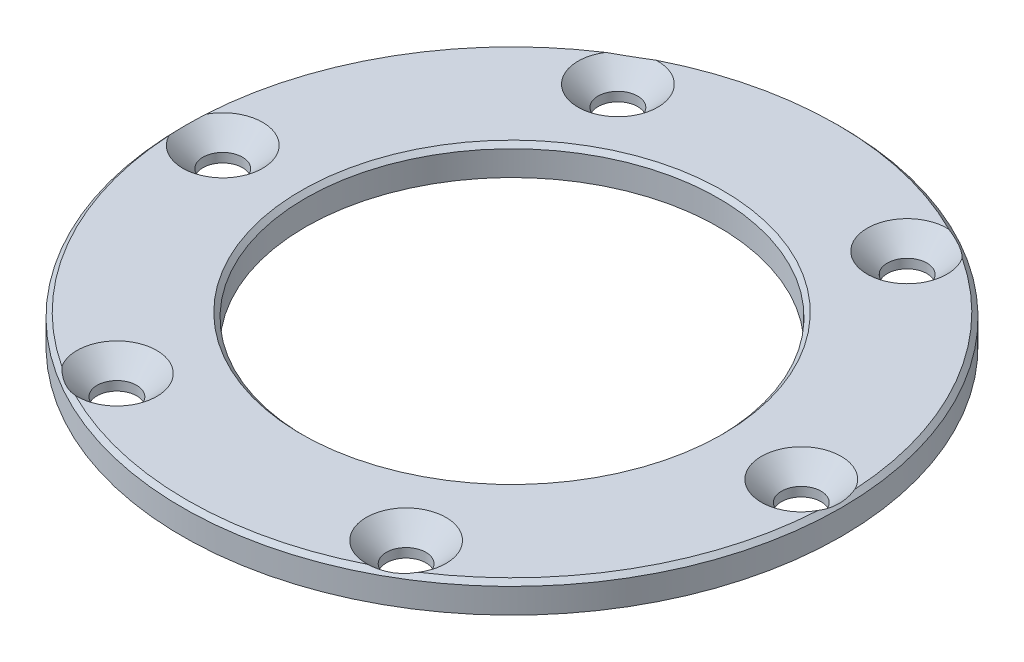
ISO-10303-21;
HEADER;
FILE_DESCRIPTION(('STEP AP214'),'2;1');
FILE_NAME('part.step','',(''),(''),'','','');
FILE_SCHEMA(('AUTOMOTIVE_DESIGN { 1 0 10303 214 1 1 1 1 }'));
ENDSEC;
DATA;
#1=APPLICATION_CONTEXT('core data for automotive mechanical design processes');
#2=APPLICATION_PROTOCOL_DEFINITION('international standard','automotive_design',2000,#1);
#3=PRODUCT_CONTEXT('',#1,'mechanical');
#4=PRODUCT('Part','Part','',(#3));
#5=PRODUCT_RELATED_PRODUCT_CATEGORY('part','',(#4));
#6=PRODUCT_DEFINITION_FORMATION('','',#4);
#7=PRODUCT_DEFINITION_CONTEXT('part definition',#1,'design');
#8=PRODUCT_DEFINITION('design','',#6,#7);
#9=PRODUCT_DEFINITION_SHAPE('','',#8);
#10=(LENGTH_UNIT() NAMED_UNIT(*) SI_UNIT(.MILLI.,.METRE.));
#11=(NAMED_UNIT(*) PLANE_ANGLE_UNIT() SI_UNIT($,.RADIAN.));
#12=(NAMED_UNIT(*) SI_UNIT($,.STERADIAN.) SOLID_ANGLE_UNIT());
#13=UNCERTAINTY_MEASURE_WITH_UNIT(LENGTH_MEASURE(1.E-05),#10,'distance_accuracy_value','');
#14=(GEOMETRIC_REPRESENTATION_CONTEXT(3) GLOBAL_UNCERTAINTY_ASSIGNED_CONTEXT((#13)) GLOBAL_UNIT_ASSIGNED_CONTEXT((#10,
#11,#12)) REPRESENTATION_CONTEXT('',''));
#15=CARTESIAN_POINT('',(0.,0.,0.));
#16=DIRECTION('',(0.,0.,1.));
#17=DIRECTION('',(1.,0.,0.));
#18=AXIS2_PLACEMENT_3D('',#15,#16,#17);
#19=CARTESIAN_POINT('',(0.,148.499999999998,0.));
#20=DIRECTION('',(0.,-1.,0.));
#21=DIRECTION('',(-1.,0.,0.));
#22=AXIS2_PLACEMENT_3D('',#19,#20,#21);
#23=CYLINDRICAL_SURFACE('',#22,22.5);
#24=CARTESIAN_POINT('',(0.,148.199999999998,0.));
#25=DIRECTION('',(0.,-1.,0.));
#26=DIRECTION('',(1.,0.,0.));
#27=AXIS2_PLACEMENT_3D('',#24,#25,#26);
#28=CIRCLE('',#27,22.5);
#29=CARTESIAN_POINT('',(22.5,148.199999999998,0.));
#30=VERTEX_POINT('',#29);
#31=EDGE_CURVE('E11',#30,#30,#28,.F.);
#32=ORIENTED_EDGE('',*,*,#31,.F.);
#33=EDGE_LOOP('',(#32));
#34=FACE_BOUND('',#33,.T.);
#35=CARTESIAN_POINT('',(0.,146.499999999998,0.));
#36=DIRECTION('',(0.,-1.,0.));
#37=DIRECTION('',(1.,0.,0.));
#38=AXIS2_PLACEMENT_3D('',#35,#36,#37);
#39=CIRCLE('',#38,22.5);
#40=CARTESIAN_POINT('',(22.5,146.499999999998,0.));
#41=VERTEX_POINT('',#40);
#42=EDGE_CURVE('E24',#41,#41,#39,.T.);
#43=ORIENTED_EDGE('',*,*,#42,.F.);
#44=EDGE_LOOP('',(#43));
#45=FACE_BOUND('',#44,.T.);
#46=ADVANCED_FACE('F17',(#34,#45),#23,.T.);
#47=CARTESIAN_POINT('',(0.,148.499999999998,0.));
#48=DIRECTION('',(0.,1.,0.));
#49=DIRECTION('',(1.,0.,0.));
#50=AXIS2_PLACEMENT_3D('',#47,#48,#49);
#51=PLANE('',#50);
#52=CARTESIAN_POINT('',(-9.875,148.499999999998,-17.1040017247426));
#53=DIRECTION('',(0.,-1.,0.));
#54=DIRECTION('',(1.,0.,0.));
#55=AXIS2_PLACEMENT_3D('',#52,#53,#54);
#56=CIRCLE('',#55,2.7239523644641);
#57=CARTESIAN_POINT('',(-9.98936859496402,148.499999999998,-19.8255520748842));
#58=VERTEX_POINT('',#57);
#59=CARTESIAN_POINT('',(-12.174747443419,148.499999999998,-18.5638230084474));
#60=VERTEX_POINT('',#59);
#61=EDGE_CURVE('E31',#58,#60,#56,.T.);
#62=ORIENTED_EDGE('',*,*,#61,.T.);
#63=CARTESIAN_POINT('',(0.,148.499999999998,0.));
#64=DIRECTION('',(0.,-1.,0.));
#65=DIRECTION('',(1.,0.,0.));
#66=AXIS2_PLACEMENT_3D('',#63,#64,#65);
#67=CIRCLE('',#66,22.2);
#68=CARTESIAN_POINT('',(-22.164116038383,148.499999999998,-1.26172906643674));
#69=VERTEX_POINT('',#68);
#70=EDGE_CURVE('E35',#69,#60,#67,.T.);
#71=ORIENTED_EDGE('',*,*,#70,.F.);
#72=CARTESIAN_POINT('',(-19.75,148.499999999998,0.));
#73=DIRECTION('',(0.,-1.,0.));
#74=DIRECTION('',(1.,0.,0.));
#75=AXIS2_PLACEMENT_3D('',#72,#73,#74);
#76=CIRCLE('',#75,2.7239523644641);
#77=CARTESIAN_POINT('',(-22.164116038383,148.499999999998,1.26172906643685));
#78=VERTEX_POINT('',#77);
#79=EDGE_CURVE('E89',#69,#78,#76,.T.);
#80=ORIENTED_EDGE('',*,*,#79,.T.);
#81=CARTESIAN_POINT('',(-12.174747443419,148.499999999998,18.5638230084475));
#82=VERTEX_POINT('',#81);
#83=EDGE_CURVE('E90',#82,#78,#67,.T.);
#84=ORIENTED_EDGE('',*,*,#83,.F.);
#85=CARTESIAN_POINT('',(-9.875,148.499999999998,17.1040017247427));
#86=DIRECTION('',(0.,-1.,0.));
#87=DIRECTION('',(1.,0.,0.));
#88=AXIS2_PLACEMENT_3D('',#85,#86,#87);
#89=CIRCLE('',#88,2.7239523644641);
#90=CARTESIAN_POINT('',(-9.98936859496404,148.499999999998,19.8255520748843));
#91=VERTEX_POINT('',#90);
#92=EDGE_CURVE('E93',#82,#91,#89,.T.);
#93=ORIENTED_EDGE('',*,*,#92,.T.);
#94=CARTESIAN_POINT('',(9.98936859496403,148.499999999998,19.8255520748843));
#95=VERTEX_POINT('',#94);
#96=EDGE_CURVE('E95',#95,#91,#67,.T.);
#97=ORIENTED_EDGE('',*,*,#96,.F.);
#98=CARTESIAN_POINT('',(9.875,148.499999999998,17.1040017247427));
#99=DIRECTION('',(0.,-1.,0.));
#100=DIRECTION('',(1.,0.,0.));
#101=AXIS2_PLACEMENT_3D('',#98,#99,#100);
#102=CIRCLE('',#101,2.7239523644641);
#103=CARTESIAN_POINT('',(12.174747443419,148.499999999998,18.5638230084475));
#104=VERTEX_POINT('',#103);
#105=EDGE_CURVE('E96',#95,#104,#102,.T.);
#106=ORIENTED_EDGE('',*,*,#105,.T.);
#107=CARTESIAN_POINT('',(22.1641160383888,148.499999999993,1.26172906641579));
#108=VERTEX_POINT('',#107);
#109=EDGE_CURVE('E98',#108,#104,#67,.T.);
#110=ORIENTED_EDGE('',*,*,#109,.F.);
#111=CARTESIAN_POINT('',(19.75,148.499999999998,0.));
#112=DIRECTION('',(0.,-1.,0.));
#113=DIRECTION('',(1.,0.,0.));
#114=AXIS2_PLACEMENT_3D('',#111,#112,#113);
#115=CIRCLE('',#114,2.7239523644641);
#116=CARTESIAN_POINT('',(22.164116038383,148.499999999998,-1.26172906643674));
#117=VERTEX_POINT('',#116);
#118=EDGE_CURVE('E99',#108,#117,#115,.T.);
#119=ORIENTED_EDGE('',*,*,#118,.T.);
#120=CARTESIAN_POINT('',(12.174747443419,148.499999999998,-18.5638230084474));
#121=VERTEX_POINT('',#120);
#122=EDGE_CURVE('E76',#121,#117,#67,.T.);
#123=ORIENTED_EDGE('',*,*,#122,.F.);
#124=CARTESIAN_POINT('',(9.875,148.499999999998,-17.1040017247426));
#125=DIRECTION('',(0.,-1.,0.));
#126=DIRECTION('',(1.,0.,0.));
#127=AXIS2_PLACEMENT_3D('',#124,#125,#126);
#128=CIRCLE('',#127,2.7239523644641);
#129=CARTESIAN_POINT('',(9.98936859496405,148.499999999998,-19.8255520748842));
#130=VERTEX_POINT('',#129);
#131=EDGE_CURVE('E70',#121,#130,#128,.T.);
#132=ORIENTED_EDGE('',*,*,#131,.T.);
#133=EDGE_CURVE('E65',#58,#130,#67,.T.);
#134=ORIENTED_EDGE('',*,*,#133,.F.);
#135=EDGE_LOOP('',(#62,#71,#80,#84,#93,#97,#106,#110,#119,#123,#132,#134));
#136=FACE_BOUND('',#135,.T.);
#137=CARTESIAN_POINT('',(0.,148.499999999998,0.));
#138=DIRECTION('',(0.,-1.,0.));
#139=DIRECTION('',(1.,0.,0.));
#140=AXIS2_PLACEMENT_3D('',#137,#138,#139);
#141=CIRCLE('',#140,14.4);
#142=CARTESIAN_POINT('',(14.4,148.499999999998,0.));
#143=VERTEX_POINT('',#142);
#144=EDGE_CURVE('E74',#143,#143,#141,.F.);
#145=ORIENTED_EDGE('',*,*,#144,.F.);
#146=EDGE_LOOP('',(#145));
#147=FACE_BOUND('',#146,.T.);
#148=ADVANCED_FACE('F67',(#136,#147),#51,.T.);
#149=CARTESIAN_POINT('',(0.,146.499999999998,0.));
#150=DIRECTION('',(0.,1.,0.));
#151=DIRECTION('',(1.,0.,0.));
#152=AXIS2_PLACEMENT_3D('',#149,#150,#151);
#153=PLANE('',#152);
#154=CARTESIAN_POINT('',(-9.875,146.499999999998,-17.1040017247426));
#155=DIRECTION('',(0.,-1.,0.));
#156=DIRECTION('',(1.,0.,0.));
#157=AXIS2_PLACEMENT_3D('',#154,#155,#156);
#158=CIRCLE('',#157,1.35);
#159=CARTESIAN_POINT('',(-8.525,146.499999999998,-17.1040017247426));
#160=VERTEX_POINT('',#159);
#161=EDGE_CURVE('E104',#160,#160,#158,.T.);
#162=ORIENTED_EDGE('',*,*,#161,.F.);
#163=EDGE_LOOP('',(#162));
#164=FACE_BOUND('',#163,.T.);
#165=CARTESIAN_POINT('',(9.875,146.499999999998,-17.1040017247426));
#166=DIRECTION('',(0.,-1.,0.));
#167=DIRECTION('',(1.,0.,0.));
#168=AXIS2_PLACEMENT_3D('',#165,#166,#167);
#169=CIRCLE('',#168,1.35);
#170=CARTESIAN_POINT('',(11.225,146.499999999998,-17.1040017247426));
#171=VERTEX_POINT('',#170);
#172=EDGE_CURVE('E107',#171,#171,#169,.T.);
#173=ORIENTED_EDGE('',*,*,#172,.F.);
#174=EDGE_LOOP('',(#173));
#175=FACE_BOUND('',#174,.T.);
#176=CARTESIAN_POINT('',(19.75,146.499999999998,0.));
#177=DIRECTION('',(0.,-1.,0.));
#178=DIRECTION('',(1.,0.,0.));
#179=AXIS2_PLACEMENT_3D('',#176,#177,#178);
#180=CIRCLE('',#179,1.35);
#181=CARTESIAN_POINT('',(21.1,146.499999999998,0.));
#182=VERTEX_POINT('',#181);
#183=EDGE_CURVE('E110',#182,#182,#180,.T.);
#184=ORIENTED_EDGE('',*,*,#183,.F.);
#185=EDGE_LOOP('',(#184));
#186=FACE_BOUND('',#185,.T.);
#187=CARTESIAN_POINT('',(9.875,146.499999999998,17.1040017247427));
#188=DIRECTION('',(0.,-1.,0.));
#189=DIRECTION('',(1.,0.,0.));
#190=AXIS2_PLACEMENT_3D('',#187,#188,#189);
#191=CIRCLE('',#190,1.35);
#192=CARTESIAN_POINT('',(11.225,146.499999999998,17.1040017247427));
#193=VERTEX_POINT('',#192);
#194=EDGE_CURVE('E113',#193,#193,#191,.T.);
#195=ORIENTED_EDGE('',*,*,#194,.F.);
#196=EDGE_LOOP('',(#195));
#197=FACE_BOUND('',#196,.T.);
#198=CARTESIAN_POINT('',(-9.875,146.499999999998,17.1040017247427));
#199=DIRECTION('',(0.,-1.,0.));
#200=DIRECTION('',(1.,0.,0.));
#201=AXIS2_PLACEMENT_3D('',#198,#199,#200);
#202=CIRCLE('',#201,1.35);
#203=CARTESIAN_POINT('',(-8.525,146.499999999998,17.1040017247427));
#204=VERTEX_POINT('',#203);
#205=EDGE_CURVE('E116',#204,#204,#202,.T.);
#206=ORIENTED_EDGE('',*,*,#205,.F.);
#207=EDGE_LOOP('',(#206));
#208=FACE_BOUND('',#207,.T.);
#209=CARTESIAN_POINT('',(-19.75,146.499999999998,0.));
#210=DIRECTION('',(0.,-1.,0.));
#211=DIRECTION('',(1.,0.,0.));
#212=AXIS2_PLACEMENT_3D('',#209,#210,#211);
#213=CIRCLE('',#212,1.35);
#214=CARTESIAN_POINT('',(-18.4,146.499999999998,0.));
#215=VERTEX_POINT('',#214);
#216=EDGE_CURVE('E119',#215,#215,#213,.T.);
#217=ORIENTED_EDGE('',*,*,#216,.F.);
#218=EDGE_LOOP('',(#217));
#219=FACE_BOUND('',#218,.T.);
#220=CARTESIAN_POINT('',(0.,146.499999999998,0.));
#221=DIRECTION('',(0.,-1.,0.));
#222=DIRECTION('',(1.,0.,0.));
#223=AXIS2_PLACEMENT_3D('',#220,#221,#222);
#224=CIRCLE('',#223,14.1);
#225=CARTESIAN_POINT('',(14.1,146.499999999998,0.));
#226=VERTEX_POINT('',#225);
#227=EDGE_CURVE('E122',#226,#226,#224,.F.);
#228=ORIENTED_EDGE('',*,*,#227,.T.);
#229=EDGE_LOOP('',(#228));
#230=FACE_BOUND('',#229,.T.);
#231=ORIENTED_EDGE('',*,*,#42,.T.);
#232=EDGE_LOOP('',(#231));
#233=FACE_BOUND('',#232,.T.);
#234=ADVANCED_FACE('F209',(#164,#175,#186,#197,#208,#219,#230,#233),#153,.F.);
#235=CARTESIAN_POINT('',(0.,138.499999999998,0.));
#236=DIRECTION('',(0.,1.,0.));
#237=DIRECTION('',(-1.,0.,0.));
#238=AXIS2_PLACEMENT_3D('',#235,#236,#237);
#239=CYLINDRICAL_SURFACE('',#238,14.1);
#240=CARTESIAN_POINT('',(0.,148.199999999998,0.));
#241=DIRECTION('',(0.,-1.,0.));
#242=DIRECTION('',(1.,0.,0.));
#243=AXIS2_PLACEMENT_3D('',#240,#241,#242);
#244=CIRCLE('',#243,14.1);
#245=CARTESIAN_POINT('',(14.1,148.199999999998,0.));
#246=VERTEX_POINT('',#245);
#247=EDGE_CURVE('E82',#246,#246,#244,.T.);
#248=ORIENTED_EDGE('',*,*,#247,.F.);
#249=EDGE_LOOP('',(#248));
#250=FACE_BOUND('',#249,.T.);
#251=ORIENTED_EDGE('',*,*,#227,.F.);
#252=EDGE_LOOP('',(#251));
#253=FACE_BOUND('',#252,.T.);
#254=ADVANCED_FACE('F215',(#250,#253),#239,.F.);
#255=CARTESIAN_POINT('',(0.,148.499999999998,0.));
#256=DIRECTION('',(0.,1.,0.));
#257=DIRECTION('',(1.,0.,0.));
#258=AXIS2_PLACEMENT_3D('',#255,#256,#257);
#259=CONICAL_SURFACE('',#258,14.4,0.785398163397448);
#260=ORIENTED_EDGE('',*,*,#247,.T.);
#261=EDGE_LOOP('',(#260));
#262=FACE_BOUND('',#261,.T.);
#263=ORIENTED_EDGE('',*,*,#144,.T.);
#264=EDGE_LOOP('',(#263));
#265=FACE_BOUND('',#264,.T.);
#266=ADVANCED_FACE('F144',(#262,#265),#259,.F.);
#267=CARTESIAN_POINT('',(0.,148.499999999998,0.));
#268=DIRECTION('',(0.,-1.,0.));
#269=DIRECTION('',(-1.,0.,0.));
#270=AXIS2_PLACEMENT_3D('',#267,#268,#269);
#271=CONICAL_SURFACE('',#270,22.2,0.785398163397451);
#272=CARTESIAN_POINT('',(-12.1754131020972,148.500199999998,-18.5631472502181));
#273=CARTESIAN_POINT('',(-12.0991354940543,148.477245006528,-18.6406361657122));
#274=CARTESIAN_POINT('',(-12.0198524515073,148.456932782419,-18.716009225925));
#275=CARTESIAN_POINT('',(-11.8555912026091,148.42196769394,-18.8617966313019));
#276=CARTESIAN_POINT('',(-11.7706093406277,148.407318503794,-18.9322077329658));
#277=CARTESIAN_POINT('',(-11.5979661430153,148.38442878904,-19.0652382232727));
#278=CARTESIAN_POINT('',(-11.5104591600865,148.376010984705,-19.1280268283725));
#279=CARTESIAN_POINT('',(-11.3310683527894,148.365095106497,-19.2475047776166));
#280=CARTESIAN_POINT('',(-11.2391862876018,148.36259467347,-19.3041965438597));
#281=CARTESIAN_POINT('',(-11.0554419751498,148.363554032639,-19.4088833938827));
#282=CARTESIAN_POINT('',(-10.9637242357483,148.366780764826,-19.4571346610699));
#283=CARTESIAN_POINT('',(-10.777536264253,148.378669208162,-19.5473064961766));
#284=CARTESIAN_POINT('',(-10.6830651699169,148.387332639694,-19.5892250549685));
#285=CARTESIAN_POINT('',(-10.4893231929499,148.410230927378,-19.6677146513345));
#286=CARTESIAN_POINT('',(-10.3899928320523,148.424621950263,-19.7040924625305));
#287=CARTESIAN_POINT('',(-10.1900265034941,148.458601256755,-19.7700284286542));
#288=CARTESIAN_POINT('',(-10.0893913188105,148.478186549339,-19.7995904900501));
#289=CARTESIAN_POINT('',(-9.98845054183149,148.500199999998,-19.8257906730951));
#290=B_SPLINE_CURVE_WITH_KNOTS('',3,(#272,#273,#274,#275,#276,#277,#278,#279,#280,#281,#282,
#283,#284,#285,#286,#287,#288,#289),.UNSPECIFIED.,.F.,.F.,(4,2,2,2,2,2,2,2,4),(0.,
0.333360644824797,0.666937215272782,0.990614736175415,1.31416319056383,1.62484543312623,
1.93562603728323,2.25553469998118,2.57525954767152),.UNSPECIFIED.);
#291=EDGE_CURVE('E78',#60,#58,#290,.T.);
#292=ORIENTED_EDGE('',*,*,#291,.T.);
#293=ORIENTED_EDGE('',*,*,#133,.T.);
#294=CARTESIAN_POINT('',(9.98845054183152,148.500199999998,-19.8257906730951));
#295=CARTESIAN_POINT('',(10.0936967151826,148.477245006528,-19.7984767845371));
#296=CARTESIAN_POINT('',(10.1986132213614,148.456932782419,-19.7675021857085));
#297=CARTESIAN_POINT('',(10.4069994424188,148.42196769394,-19.6981414739938));
#298=CARTESIAN_POINT('',(10.5104681761589,148.407318503794,-19.6597505734889));
#299=CARTESIAN_POINT('',(10.7119975590487,148.38442878904,-19.5767524237195));
#300=CARTESIAN_POINT('',(10.8101275775977,148.376010984705,-19.5323634560445));
#301=CARTESIAN_POINT('',(11.0032939204837,148.365095106497,-19.4367454343418));
#302=CARTESIAN_POINT('',(11.0983314628294,148.36259467347,-19.3855191148587));
#303=CARTESIAN_POINT('',(11.2808650906175,148.363554032639,-19.2787352974858));
#304=CARTESIAN_POINT('',(11.3685107834672,148.366780764826,-19.2234310387801));
#305=CARTESIAN_POINT('',(11.5396958691231,148.378669208162,-19.1072734431395));
#306=CARTESIAN_POINT('',(11.623233953095,148.387332639694,-19.046418354917));
#307=CARTESIAN_POINT('',(11.7880789259643,148.410230927378,-18.9178776792672));
#308=CARTESIAN_POINT('',(11.8692482150429,148.424621950263,-18.8500439689608));
#309=CARTESIAN_POINT('',(12.0263336010082,148.458601256755,-18.7098360315897));
#310=CARTESIAN_POINT('',(12.102252689507,148.478186549339,-18.6374644358371));
#311=CARTESIAN_POINT('',(12.1754131020972,148.500199999998,-18.563147250218));
#312=B_SPLINE_CURVE_WITH_KNOTS('',3,(#294,#295,#296,#297,#298,#299,#300,#301,#302,#303,#304,
#305,#306,#307,#308,#309,#310,#311),.UNSPECIFIED.,.F.,.F.,(4,2,2,2,2,2,2,2,4),(0.,
0.333360644824834,0.666937215272804,0.990614736175439,1.31416319056387,1.62484543312629,
1.93562603728329,2.25553469998123,2.57525954767161),.UNSPECIFIED.);
#313=EDGE_CURVE('E83',#130,#121,#312,.T.);
#314=ORIENTED_EDGE('',*,*,#313,.T.);
#315=ORIENTED_EDGE('',*,*,#122,.T.);
#316=CARTESIAN_POINT('',(22.1638636439287,148.500199999998,-1.26264342287697));
#317=CARTESIAN_POINT('',(22.1928322092369,148.477245006528,-1.15784061882487));
#318=CARTESIAN_POINT('',(22.2184656728687,148.456932782419,-1.05149295978341));
#319=CARTESIAN_POINT('',(22.2625906450279,148.42196769394,-0.836344842691737));
#320=CARTESIAN_POINT('',(22.2810775167866,148.407318503794,-0.727542840522983));
#321=CARTESIAN_POINT('',(22.309963702064,148.38442878904,-0.51151420044662));
#322=CARTESIAN_POINT('',(22.3205867376842,148.376010984705,-0.404336627671881));
#323=CARTESIAN_POINT('',(22.3343622732731,148.365095106497,-0.189240656725157));
#324=CARTESIAN_POINT('',(22.3375177504312,148.36259467347,-0.0813225709989644));
#325=CARTESIAN_POINT('',(22.3363070657673,148.363554032639,0.130148096396913));
#326=CARTESIAN_POINT('',(22.3322350192155,148.366780764826,0.233703622289854));
#327=CARTESIAN_POINT('',(22.3172321333762,148.378669208162,0.440033053037222));
#328=CARTESIAN_POINT('',(22.3062991230119,148.387332639694,0.542806700051582));
#329=CARTESIAN_POINT('',(22.2774021189141,148.410230927378,0.749836972067454));
#330=CARTESIAN_POINT('',(22.2592410470952,148.424621950263,0.854048493569845));
#331=CARTESIAN_POINT('',(22.2163601045023,148.458601256755,1.06019239706461));
#332=CARTESIAN_POINT('',(22.1916440083175,148.478186549339,1.16212605421309));
#333=CARTESIAN_POINT('',(22.1638636439287,148.500199999998,1.2626434228771));
#334=B_SPLINE_CURVE_WITH_KNOTS('',3,(#316,#317,#318,#319,#320,#321,#322,#323,#324,#325,#326,
#327,#328,#329,#330,#331,#332,#333),.UNSPECIFIED.,.F.,.F.,(4,2,2,2,2,2,2,2,4),(0.,
0.333360644824826,0.666937215272805,0.990614736175445,1.31416319056387,1.62484543312629,
1.93562603728329,2.25553469998122,2.57525954767159),.UNSPECIFIED.);
#335=EDGE_CURVE('E173',#117,#108,#334,.T.);
#336=ORIENTED_EDGE('',*,*,#335,.T.);
#337=ORIENTED_EDGE('',*,*,#109,.T.);
#338=CARTESIAN_POINT('',(12.1754131020972,148.500199999998,18.5631472502182));
#339=CARTESIAN_POINT('',(12.0991354940543,148.477245006528,18.6406361657123));
#340=CARTESIAN_POINT('',(12.0198524515073,148.456932782419,18.7160092259252));
#341=CARTESIAN_POINT('',(11.8555912026091,148.42196769394,18.8617966313021));
#342=CARTESIAN_POINT('',(11.7706093406277,148.407318503794,18.932207732966));
#343=CARTESIAN_POINT('',(11.5979661430153,148.38442878904,19.0652382232729));
#344=CARTESIAN_POINT('',(11.5104591600865,148.376010984705,19.1280268283727));
#345=CARTESIAN_POINT('',(11.3310683527894,148.365095106497,19.2475047776167));
#346=CARTESIAN_POINT('',(11.2391862876018,148.36259467347,19.3041965438598));
#347=CARTESIAN_POINT('',(11.0554419751498,148.363554032639,19.4088833938828));
#348=CARTESIAN_POINT('',(10.9637242357483,148.366780764826,19.45713466107));
#349=CARTESIAN_POINT('',(10.7775362642531,148.378669208162,19.5473064961768));
#350=CARTESIAN_POINT('',(10.6830651699169,148.387332639694,19.5892250549687));
#351=CARTESIAN_POINT('',(10.4893231929499,148.410230927378,19.6677146513347));
#352=CARTESIAN_POINT('',(10.3899928320523,148.424621950263,19.7040924625307));
#353=CARTESIAN_POINT('',(10.1900265034941,148.458601256755,19.7700284286544));
#354=CARTESIAN_POINT('',(10.0893913188105,148.478186549339,19.7995904900503));
#355=CARTESIAN_POINT('',(9.9884505418315,148.500199999998,19.8257906730952));
#356=B_SPLINE_CURVE_WITH_KNOTS('',3,(#338,#339,#340,#341,#342,#343,#344,#345,#346,#347,#348,
#349,#350,#351,#352,#353,#354,#355),.UNSPECIFIED.,.F.,.F.,(4,2,2,2,2,2,2,2,4),(0.,
0.333360644824836,0.666937215272802,0.990614736175438,1.31416319056387,1.62484543312629,
1.93562603728329,2.25553469998122,2.57525954767159),.UNSPECIFIED.);
#357=EDGE_CURVE('E167',#104,#95,#356,.T.);
#358=ORIENTED_EDGE('',*,*,#357,.T.);
#359=ORIENTED_EDGE('',*,*,#96,.T.);
#360=CARTESIAN_POINT('',(-9.98845054183151,148.500199999998,19.8257906730952));
#361=CARTESIAN_POINT('',(-10.0936967151826,148.477245006528,19.7984767845372));
#362=CARTESIAN_POINT('',(-10.1986132213614,148.456932782419,19.7675021857086));
#363=CARTESIAN_POINT('',(-10.4069994424188,148.42196769394,19.6981414739939));
#364=CARTESIAN_POINT('',(-10.5104681761588,148.407318503794,19.659750573489));
#365=CARTESIAN_POINT('',(-10.7119975590487,148.38442878904,19.5767524237196));
#366=CARTESIAN_POINT('',(-10.8101275775977,148.376010984705,19.5323634560446));
#367=CARTESIAN_POINT('',(-11.0032939204837,148.365095106497,19.4367454343419));
#368=CARTESIAN_POINT('',(-11.0983314628294,148.36259467347,19.3855191148588));
#369=CARTESIAN_POINT('',(-11.2808650906175,148.363554032639,19.2787352974859));
#370=CARTESIAN_POINT('',(-11.3685107834672,148.366780764826,19.2234310387802));
#371=CARTESIAN_POINT('',(-11.5396958691231,148.378669208162,19.1072734431396));
#372=CARTESIAN_POINT('',(-11.623233953095,148.387332639694,19.0464183549171));
#373=CARTESIAN_POINT('',(-11.7880789259642,148.410230927378,18.9178776792673));
#374=CARTESIAN_POINT('',(-11.8692482150429,148.424621950263,18.8500439689609));
#375=CARTESIAN_POINT('',(-12.0263336010081,148.458601256755,18.7098360315898));
#376=CARTESIAN_POINT('',(-12.102252689507,148.478186549339,18.6374644358373));
#377=CARTESIAN_POINT('',(-12.1754131020972,148.500199999998,18.5631472502182));
#378=B_SPLINE_CURVE_WITH_KNOTS('',3,(#360,#361,#362,#363,#364,#365,#366,#367,#368,#369,#370,
#371,#372,#373,#374,#375,#376,#377),.UNSPECIFIED.,.F.,.F.,(4,2,2,2,2,2,2,2,4),(0.,
0.333360644824836,0.666937215272811,0.990614736175454,1.31416319056389,1.62484543312631,
1.9356260372833,2.25553469998123,2.5752595476716),.UNSPECIFIED.);
#379=EDGE_CURVE('E160',#91,#82,#378,.T.);
#380=ORIENTED_EDGE('',*,*,#379,.T.);
#381=ORIENTED_EDGE('',*,*,#83,.T.);
#382=CARTESIAN_POINT('',(-22.1638636439287,148.500199999998,1.26264342287709));
#383=CARTESIAN_POINT('',(-22.1928322092369,148.477245006528,1.15784061882499));
#384=CARTESIAN_POINT('',(-22.2184656728687,148.456932782419,1.05149295978353));
#385=CARTESIAN_POINT('',(-22.2625906450279,148.42196769394,0.836344842691855));
#386=CARTESIAN_POINT('',(-22.2810775167866,148.407318503794,0.727542840523101));
#387=CARTESIAN_POINT('',(-22.309963702064,148.38442878904,0.511514200446738));
#388=CARTESIAN_POINT('',(-22.3205867376842,148.376010984705,0.404336627671999));
#389=CARTESIAN_POINT('',(-22.3343622732731,148.365095106497,0.189240656725275));
#390=CARTESIAN_POINT('',(-22.3375177504312,148.36259467347,0.0813225709990819));
#391=CARTESIAN_POINT('',(-22.3363070657673,148.363554032639,-0.130148096396795));
#392=CARTESIAN_POINT('',(-22.3322350192155,148.366780764826,-0.233703622289735));
#393=CARTESIAN_POINT('',(-22.3172321333762,148.378669208162,-0.440033053037103));
#394=CARTESIAN_POINT('',(-22.3062991230119,148.387332639694,-0.542806700051464));
#395=CARTESIAN_POINT('',(-22.2774021189141,148.410230927378,-0.749836972067336));
#396=CARTESIAN_POINT('',(-22.2592410470952,148.424621950263,-0.854048493569726));
#397=CARTESIAN_POINT('',(-22.2163601045023,148.458601256755,-1.06019239706449));
#398=CARTESIAN_POINT('',(-22.1916440083175,148.478186549339,-1.16212605421297));
#399=CARTESIAN_POINT('',(-22.1638636439287,148.500199999998,-1.26264342287698));
#400=B_SPLINE_CURVE_WITH_KNOTS('',3,(#382,#383,#384,#385,#386,#387,#388,#389,#390,#391,#392,
#393,#394,#395,#396,#397,#398,#399),.UNSPECIFIED.,.F.,.F.,(4,2,2,2,2,2,2,2,4),(0.,
0.333360644824826,0.666937215272806,0.990614736175445,1.31416319056387,1.62484543312629,
1.93562603728329,2.25553469998122,2.57525954767158),.UNSPECIFIED.);
#401=EDGE_CURVE('E151',#78,#69,#400,.T.);
#402=ORIENTED_EDGE('',*,*,#401,.T.);
#403=ORIENTED_EDGE('',*,*,#70,.T.);
#404=EDGE_LOOP('',(#292,#293,#314,#315,#336,#337,#358,#359,#380,#381,#402,#403));
#405=FACE_BOUND('',#404,.T.);
#406=ORIENTED_EDGE('',*,*,#31,.T.);
#407=EDGE_LOOP('',(#406));
#408=FACE_BOUND('',#407,.T.);
#409=ADVANCED_FACE('F79',(#405,#408),#271,.T.);
#410=CARTESIAN_POINT('',(-19.75,148.526047635534,0.));
#411=DIRECTION('',(0.,1.,0.));
#412=DIRECTION('',(0.,0.,1.));
#413=AXIS2_PLACEMENT_3D('',#410,#411,#412);
#414=CYLINDRICAL_SURFACE('',#413,1.35);
#415=CARTESIAN_POINT('',(-19.75,147.126047635534,0.));
#416=DIRECTION('',(0.,-1.,0.));
#417=DIRECTION('',(0.,0.,1.));
#418=AXIS2_PLACEMENT_3D('',#415,#416,#417);
#419=CIRCLE('',#418,1.35);
#420=CARTESIAN_POINT('',(-19.75,147.126047635534,1.35000000000006));
#421=VERTEX_POINT('',#420);
#422=EDGE_CURVE('E267',#421,#421,#419,.T.);
#423=ORIENTED_EDGE('',*,*,#422,.F.);
#424=EDGE_LOOP('',(#423));
#425=FACE_BOUND('',#424,.T.);
#426=ORIENTED_EDGE('',*,*,#216,.T.);
#427=EDGE_LOOP('',(#426));
#428=FACE_BOUND('',#427,.T.);
#429=ADVANCED_FACE('F143',(#425,#428),#414,.F.);
#430=CARTESIAN_POINT('',(-19.75,148.526047635534,0.));
#431=DIRECTION('',(0.,1.,0.));
#432=DIRECTION('',(0.,0.,1.));
#433=AXIS2_PLACEMENT_3D('',#430,#431,#432);
#434=CONICAL_SURFACE('',#433,2.75,0.785398163397448);
#435=ORIENTED_EDGE('',*,*,#79,.F.);
#436=ORIENTED_EDGE('',*,*,#401,.F.);
#437=EDGE_LOOP('',(#435,#436));
#438=FACE_BOUND('',#437,.T.);
#439=ORIENTED_EDGE('',*,*,#422,.T.);
#440=EDGE_LOOP('',(#439));
#441=FACE_BOUND('',#440,.T.);
#442=ADVANCED_FACE('F238',(#438,#441),#434,.F.);
#443=CARTESIAN_POINT('',(-9.875,148.526047635534,17.1040017247427));
#444=DIRECTION('',(0.,1.,0.));
#445=DIRECTION('',(0.866025403784439,0.,0.5));
#446=AXIS2_PLACEMENT_3D('',#443,#444,#445);
#447=CYLINDRICAL_SURFACE('',#446,1.35);
#448=CARTESIAN_POINT('',(-9.875,147.126047635534,17.1040017247427));
#449=DIRECTION('',(0.,-1.,0.));
#450=DIRECTION('',(0.866025403784439,0.,0.5));
#451=AXIS2_PLACEMENT_3D('',#448,#449,#450);
#452=CIRCLE('',#451,1.35);
#453=CARTESIAN_POINT('',(-8.70586570489101,147.126047635534,17.7790017247427));
#454=VERTEX_POINT('',#453);
#455=EDGE_CURVE('E266',#454,#454,#452,.T.);
#456=ORIENTED_EDGE('',*,*,#455,.F.);
#457=EDGE_LOOP('',(#456));
#458=FACE_BOUND('',#457,.T.);
#459=ORIENTED_EDGE('',*,*,#205,.T.);
#460=EDGE_LOOP('',(#459));
#461=FACE_BOUND('',#460,.T.);
#462=ADVANCED_FACE('F244',(#458,#461),#447,.F.);
#463=CARTESIAN_POINT('',(-9.875,148.526047635534,17.1040017247427));
#464=DIRECTION('',(0.,1.,0.));
#465=DIRECTION('',(0.866025403784439,0.,0.5));
#466=AXIS2_PLACEMENT_3D('',#463,#464,#465);
#467=CONICAL_SURFACE('',#466,2.75,0.785398163397448);
#468=ORIENTED_EDGE('',*,*,#92,.F.);
#469=ORIENTED_EDGE('',*,*,#379,.F.);
#470=EDGE_LOOP('',(#468,#469));
#471=FACE_BOUND('',#470,.T.);
#472=ORIENTED_EDGE('',*,*,#455,.T.);
#473=EDGE_LOOP('',(#472));
#474=FACE_BOUND('',#473,.T.);
#475=ADVANCED_FACE('F250',(#471,#474),#467,.F.);
#476=CARTESIAN_POINT('',(9.875,148.526047635534,17.1040017247427));
#477=DIRECTION('',(0.,1.,0.));
#478=DIRECTION('',(0.866025403784439,0.,-0.5));
#479=AXIS2_PLACEMENT_3D('',#476,#477,#478);
#480=CYLINDRICAL_SURFACE('',#479,1.35);
#481=CARTESIAN_POINT('',(9.875,147.126047635534,17.1040017247427));
#482=DIRECTION('',(0.,-1.,0.));
#483=DIRECTION('',(0.866025403784439,0.,-0.5));
#484=AXIS2_PLACEMENT_3D('',#481,#482,#483);
#485=CIRCLE('',#484,1.35);
#486=CARTESIAN_POINT('',(11.044134295109,147.126047635534,16.4290017247428));
#487=VERTEX_POINT('',#486);
#488=EDGE_CURVE('E268',#487,#487,#485,.T.);
#489=ORIENTED_EDGE('',*,*,#488,.F.);
#490=EDGE_LOOP('',(#489));
#491=FACE_BOUND('',#490,.T.);
#492=ORIENTED_EDGE('',*,*,#194,.T.);
#493=EDGE_LOOP('',(#492));
#494=FACE_BOUND('',#493,.T.);
#495=ADVANCED_FACE('F253',(#491,#494),#480,.F.);
#496=CARTESIAN_POINT('',(9.875,148.526047635534,17.1040017247427));
#497=DIRECTION('',(0.,1.,0.));
#498=DIRECTION('',(0.866025403784439,0.,-0.5));
#499=AXIS2_PLACEMENT_3D('',#496,#497,#498);
#500=CONICAL_SURFACE('',#499,2.75,0.785398163397448);
#501=ORIENTED_EDGE('',*,*,#105,.F.);
#502=ORIENTED_EDGE('',*,*,#357,.F.);
#503=EDGE_LOOP('',(#501,#502));
#504=FACE_BOUND('',#503,.T.);
#505=ORIENTED_EDGE('',*,*,#488,.T.);
#506=EDGE_LOOP('',(#505));
#507=FACE_BOUND('',#506,.T.);
#508=ADVANCED_FACE('F186',(#504,#507),#500,.F.);
#509=CARTESIAN_POINT('',(19.75,148.526047635534,0.));
#510=DIRECTION('',(0.,1.,0.));
#511=DIRECTION('',(0.,0.,-1.));
#512=AXIS2_PLACEMENT_3D('',#509,#510,#511);
#513=CYLINDRICAL_SURFACE('',#512,1.35);
#514=CARTESIAN_POINT('',(19.75,147.126047635534,0.));
#515=DIRECTION('',(0.,-1.,0.));
#516=DIRECTION('',(0.,0.,-1.));
#517=AXIS2_PLACEMENT_3D('',#514,#515,#516);
#518=CIRCLE('',#517,1.35);
#519=CARTESIAN_POINT('',(19.75,147.126047635534,-1.34999999999994));
#520=VERTEX_POINT('',#519);
#521=EDGE_CURVE('E272',#520,#520,#518,.T.);
#522=ORIENTED_EDGE('',*,*,#521,.F.);
#523=EDGE_LOOP('',(#522));
#524=FACE_BOUND('',#523,.T.);
#525=ORIENTED_EDGE('',*,*,#183,.T.);
#526=EDGE_LOOP('',(#525));
#527=FACE_BOUND('',#526,.T.);
#528=ADVANCED_FACE('F184',(#524,#527),#513,.F.);
#529=CARTESIAN_POINT('',(19.75,148.526047635534,0.));
#530=DIRECTION('',(0.,1.,0.));
#531=DIRECTION('',(0.,0.,-1.));
#532=AXIS2_PLACEMENT_3D('',#529,#530,#531);
#533=CONICAL_SURFACE('',#532,2.75,0.785398163397448);
#534=ORIENTED_EDGE('',*,*,#118,.F.);
#535=ORIENTED_EDGE('',*,*,#335,.F.);
#536=EDGE_LOOP('',(#534,#535));
#537=FACE_BOUND('',#536,.T.);
#538=ORIENTED_EDGE('',*,*,#521,.T.);
#539=EDGE_LOOP('',(#538));
#540=FACE_BOUND('',#539,.T.);
#541=ADVANCED_FACE('F180',(#537,#540),#533,.F.);
#542=CARTESIAN_POINT('',(9.875,148.526047635534,-17.1040017247426));
#543=DIRECTION('',(0.,1.,0.));
#544=DIRECTION('',(-0.866025403784438,0.,-0.5));
#545=AXIS2_PLACEMENT_3D('',#542,#543,#544);
#546=CYLINDRICAL_SURFACE('',#545,1.35);
#547=CARTESIAN_POINT('',(9.875,147.126047635534,-17.1040017247426));
#548=DIRECTION('',(0.,-1.,0.));
#549=DIRECTION('',(-0.866025403784438,0.,-0.5));
#550=AXIS2_PLACEMENT_3D('',#547,#548,#549);
#551=CIRCLE('',#550,1.35);
#552=CARTESIAN_POINT('',(8.70586570489101,147.126047635534,-17.7790017247426));
#553=VERTEX_POINT('',#552);
#554=EDGE_CURVE('E277',#553,#553,#551,.T.);
#555=ORIENTED_EDGE('',*,*,#554,.F.);
#556=EDGE_LOOP('',(#555));
#557=FACE_BOUND('',#556,.T.);
#558=ORIENTED_EDGE('',*,*,#172,.T.);
#559=EDGE_LOOP('',(#558));
#560=FACE_BOUND('',#559,.T.);
#561=ADVANCED_FACE('F183',(#557,#560),#546,.F.);
#562=CARTESIAN_POINT('',(9.875,148.526047635534,-17.1040017247426));
#563=DIRECTION('',(0.,1.,0.));
#564=DIRECTION('',(-0.866025403784438,0.,-0.5));
#565=AXIS2_PLACEMENT_3D('',#562,#563,#564);
#566=CONICAL_SURFACE('',#565,2.75,0.785398163397448);
#567=ORIENTED_EDGE('',*,*,#131,.F.);
#568=ORIENTED_EDGE('',*,*,#313,.F.);
#569=EDGE_LOOP('',(#567,#568));
#570=FACE_BOUND('',#569,.T.);
#571=ORIENTED_EDGE('',*,*,#554,.T.);
#572=EDGE_LOOP('',(#571));
#573=FACE_BOUND('',#572,.T.);
#574=ADVANCED_FACE('F188',(#570,#573),#566,.F.);
#575=CARTESIAN_POINT('',(-9.875,148.526047635534,-17.1040017247426));
#576=DIRECTION('',(0.,1.,0.));
#577=DIRECTION('',(-0.866025403784439,0.,0.5));
#578=AXIS2_PLACEMENT_3D('',#575,#576,#577);
#579=CYLINDRICAL_SURFACE('',#578,1.35);
#580=CARTESIAN_POINT('',(-9.875,147.126047635534,-17.1040017247426));
#581=DIRECTION('',(0.,-1.,0.));
#582=DIRECTION('',(-0.866025403784439,0.,0.5));
#583=AXIS2_PLACEMENT_3D('',#580,#581,#582);
#584=CIRCLE('',#583,1.35);
#585=CARTESIAN_POINT('',(-11.044134295109,147.126047635534,-16.4290017247427));
#586=VERTEX_POINT('',#585);
#587=EDGE_CURVE('E280',#586,#586,#584,.T.);
#588=ORIENTED_EDGE('',*,*,#587,.F.);
#589=EDGE_LOOP('',(#588));
#590=FACE_BOUND('',#589,.T.);
#591=ORIENTED_EDGE('',*,*,#161,.T.);
#592=EDGE_LOOP('',(#591));
#593=FACE_BOUND('',#592,.T.);
#594=ADVANCED_FACE('F191',(#590,#593),#579,.F.);
#595=CARTESIAN_POINT('',(-9.875,148.526047635534,-17.1040017247426));
#596=DIRECTION('',(0.,1.,0.));
#597=DIRECTION('',(-0.866025403784439,0.,0.5));
#598=AXIS2_PLACEMENT_3D('',#595,#596,#597);
#599=CONICAL_SURFACE('',#598,2.75,0.785398163397448);
#600=ORIENTED_EDGE('',*,*,#61,.F.);
#601=ORIENTED_EDGE('',*,*,#291,.F.);
#602=EDGE_LOOP('',(#600,#601));
#603=FACE_BOUND('',#602,.T.);
#604=ORIENTED_EDGE('',*,*,#587,.T.);
#605=EDGE_LOOP('',(#604));
#606=FACE_BOUND('',#605,.T.);
#607=ADVANCED_FACE('F85',(#603,#606),#599,.F.);
#608=CLOSED_SHELL('',(#46,#148,#234,#254,#266,#409,#429,#442,#462,#475,#495,#508,#528,#541,#561,
#574,#594,#607));
#609=MANIFOLD_SOLID_BREP('B1',#608);
#610=ADVANCED_BREP_SHAPE_REPRESENTATION('',(#18,#609),#14);
#611=SHAPE_DEFINITION_REPRESENTATION(#9,#610);
ENDSEC;
END-ISO-10303-21;
